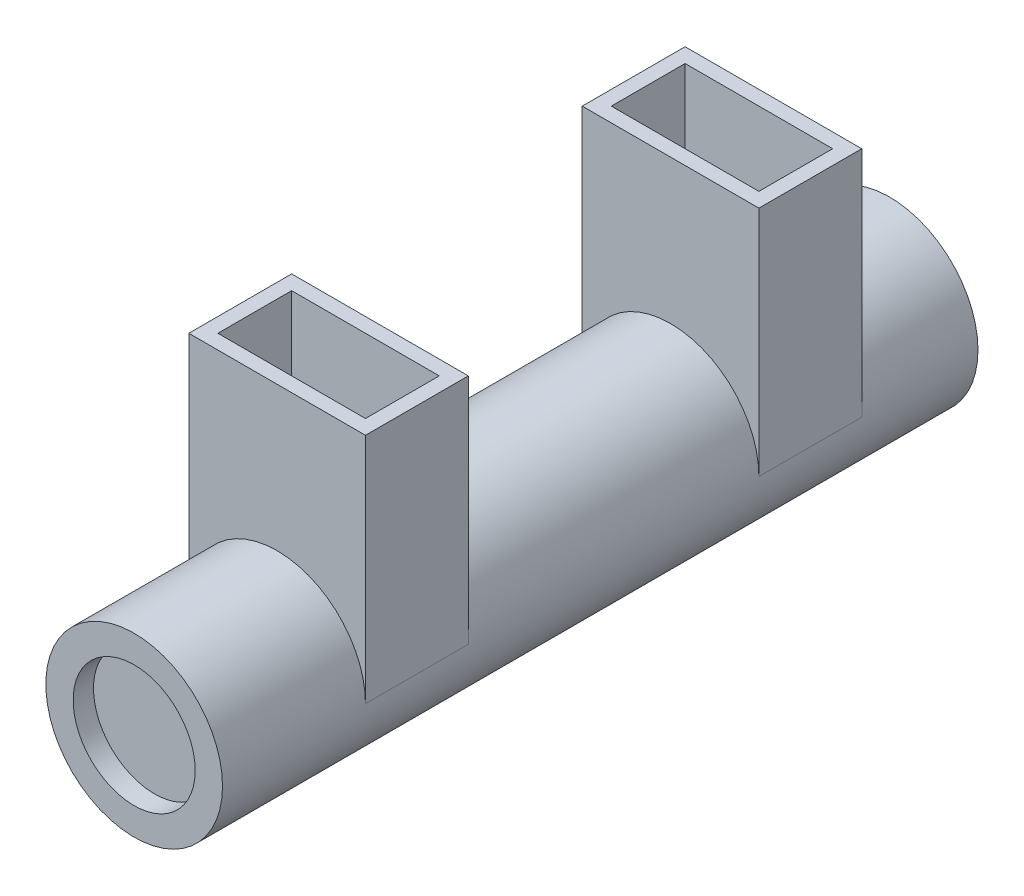
ISO-10303-21;
HEADER;
FILE_DESCRIPTION(('STEP AP214'),'2;1');
FILE_NAME('part.step','',(''),(''),'','','');
FILE_SCHEMA(('AUTOMOTIVE_DESIGN { 1 0 10303 214 1 1 1 1 }'));
ENDSEC;
DATA;
#1=APPLICATION_CONTEXT('core data for automotive mechanical design processes');
#2=APPLICATION_PROTOCOL_DEFINITION('international standard','automotive_design',2000,#1);
#3=PRODUCT_CONTEXT('',#1,'mechanical');
#4=PRODUCT('Part','Part','',(#3));
#5=PRODUCT_RELATED_PRODUCT_CATEGORY('part','',(#4));
#6=PRODUCT_DEFINITION_FORMATION('','',#4);
#7=PRODUCT_DEFINITION_CONTEXT('part definition',#1,'design');
#8=PRODUCT_DEFINITION('design','',#6,#7);
#9=PRODUCT_DEFINITION_SHAPE('','',#8);
#10=(LENGTH_UNIT() NAMED_UNIT(*) SI_UNIT(.MILLI.,.METRE.));
#11=(NAMED_UNIT(*) PLANE_ANGLE_UNIT() SI_UNIT($,.RADIAN.));
#12=(NAMED_UNIT(*) SI_UNIT($,.STERADIAN.) SOLID_ANGLE_UNIT());
#13=UNCERTAINTY_MEASURE_WITH_UNIT(LENGTH_MEASURE(1.E-05),#10,'distance_accuracy_value','');
#14=(GEOMETRIC_REPRESENTATION_CONTEXT(3) GLOBAL_UNCERTAINTY_ASSIGNED_CONTEXT((#13)) GLOBAL_UNIT_ASSIGNED_CONTEXT((#10,
#11,#12)) REPRESENTATION_CONTEXT('',''));
#15=CARTESIAN_POINT('',(0.,0.,0.));
#16=DIRECTION('',(0.,0.,1.));
#17=DIRECTION('',(1.,0.,0.));
#18=AXIS2_PLACEMENT_3D('',#15,#16,#17);
#19=CARTESIAN_POINT('',(0.,80.,250.8));
#20=DIRECTION('',(0.,1.,0.));
#21=DIRECTION('',(0.,0.,-1.));
#22=AXIS2_PLACEMENT_3D('',#19,#20,#21);
#23=PLANE('',#22);
#24=DIRECTION('',(0.,0.,-1.));
#25=VECTOR('',#24,1.);
#26=CARTESIAN_POINT('',(-30.4,80.,210.8));
#27=LINE('',#26,#25);
#28=CARTESIAN_POINT('',(-30.4,80.,210.8));
#29=VERTEX_POINT('',#28);
#30=CARTESIAN_POINT('',(-30.4,80.,175.4));
#31=VERTEX_POINT('',#30);
#32=EDGE_CURVE('E271',#29,#31,#27,.T.);
#33=ORIENTED_EDGE('',*,*,#32,.F.);
#34=DIRECTION('',(-1.,0.,0.));
#35=VECTOR('',#34,1.);
#36=CARTESIAN_POINT('',(-30.4,80.,210.8));
#37=LINE('',#36,#35);
#38=CARTESIAN_POINT('',(30.4,80.,210.8));
#39=VERTEX_POINT('',#38);
#40=EDGE_CURVE('E275',#39,#29,#37,.T.);
#41=ORIENTED_EDGE('',*,*,#40,.F.);
#42=DIRECTION('',(0.,0.,1.));
#43=VECTOR('',#42,1.);
#44=CARTESIAN_POINT('',(30.4,80.,210.8));
#45=LINE('',#44,#43);
#46=CARTESIAN_POINT('',(30.4,80.,175.4));
#47=VERTEX_POINT('',#46);
#48=EDGE_CURVE('E280',#47,#39,#45,.T.);
#49=ORIENTED_EDGE('',*,*,#48,.F.);
#50=DIRECTION('',(1.,0.,0.));
#51=VECTOR('',#50,1.);
#52=CARTESIAN_POINT('',(-30.4,80.,175.4));
#53=LINE('',#52,#51);
#54=EDGE_CURVE('E284',#31,#47,#53,.T.);
#55=ORIENTED_EDGE('',*,*,#54,.F.);
#56=EDGE_LOOP('',(#33,#41,#49,#55));
#57=FACE_BOUND('',#56,.T.);
#58=DIRECTION('',(1.,0.,0.));
#59=VECTOR('',#58,1.);
#60=CARTESIAN_POINT('',(-25.4,80.,180.4));
#61=LINE('',#60,#59);
#62=CARTESIAN_POINT('',(-25.4,80.,180.4));
#63=VERTEX_POINT('',#62);
#64=CARTESIAN_POINT('',(25.4,80.,180.4));
#65=VERTEX_POINT('',#64);
#66=EDGE_CURVE('E248',#63,#65,#61,.T.);
#67=ORIENTED_EDGE('',*,*,#66,.T.);
#68=DIRECTION('',(0.,0.,1.));
#69=VECTOR('',#68,1.);
#70=CARTESIAN_POINT('',(25.4,80.,180.4));
#71=LINE('',#70,#69);
#72=CARTESIAN_POINT('',(25.4,80.,205.8));
#73=VERTEX_POINT('',#72);
#74=EDGE_CURVE('E68',#65,#73,#71,.T.);
#75=ORIENTED_EDGE('',*,*,#74,.T.);
#76=DIRECTION('',(-1.,0.,0.));
#77=VECTOR('',#76,1.);
#78=CARTESIAN_POINT('',(-25.4,80.,205.8));
#79=LINE('',#78,#77);
#80=CARTESIAN_POINT('',(-25.4,80.,205.8));
#81=VERTEX_POINT('',#80);
#82=EDGE_CURVE('E236',#73,#81,#79,.T.);
#83=ORIENTED_EDGE('',*,*,#82,.T.);
#84=DIRECTION('',(0.,0.,-1.));
#85=VECTOR('',#84,1.);
#86=CARTESIAN_POINT('',(-25.4,80.,180.4));
#87=LINE('',#86,#85);
#88=EDGE_CURVE('E252',#81,#63,#87,.T.);
#89=ORIENTED_EDGE('',*,*,#88,.T.);
#90=EDGE_LOOP('',(#67,#75,#83,#89));
#91=FACE_BOUND('',#90,.T.);
#92=ADVANCED_FACE('F44',(#57,#91),#23,.T.);
#93=CARTESIAN_POINT('',(0.,0.,260.));
#94=DIRECTION('',(0.,0.,-1.));
#95=DIRECTION('',(-1.,0.,0.));
#96=AXIS2_PLACEMENT_3D('',#93,#94,#95);
#97=CYLINDRICAL_SURFACE('',#96,30.4);
#98=DIRECTION('',(0.,0.,1.));
#99=VECTOR('',#98,1.);
#100=CARTESIAN_POINT('',(30.4,0.,210.8));
#101=LINE('',#100,#99);
#102=CARTESIAN_POINT('',(30.4,0.,175.4));
#103=VERTEX_POINT('',#102);
#104=CARTESIAN_POINT('',(30.4,0.,210.8));
#105=VERTEX_POINT('',#104);
#106=EDGE_CURVE('E276',#103,#105,#101,.T.);
#107=ORIENTED_EDGE('',*,*,#106,.T.);
#108=CARTESIAN_POINT('',(0.,0.,210.8));
#109=DIRECTION('',(0.,0.,1.));
#110=DIRECTION('',(1.,0.,0.));
#111=AXIS2_PLACEMENT_3D('',#108,#109,#110);
#112=CIRCLE('',#111,30.4);
#113=CARTESIAN_POINT('',(-30.4,0.,210.8));
#114=VERTEX_POINT('',#113);
#115=EDGE_CURVE('E11',#105,#114,#112,.T.);
#116=ORIENTED_EDGE('',*,*,#115,.T.);
#117=DIRECTION('',(0.,0.,-1.));
#118=VECTOR('',#117,1.);
#119=CARTESIAN_POINT('',(-30.4,0.,210.8));
#120=LINE('',#119,#118);
#121=CARTESIAN_POINT('',(-30.4,0.,175.4));
#122=VERTEX_POINT('',#121);
#123=EDGE_CURVE('E262',#114,#122,#120,.T.);
#124=ORIENTED_EDGE('',*,*,#123,.T.);
#125=CARTESIAN_POINT('',(0.,0.,175.4));
#126=DIRECTION('',(0.,0.,-1.));
#127=DIRECTION('',(-1.,0.,0.));
#128=AXIS2_PLACEMENT_3D('',#125,#126,#127);
#129=CIRCLE('',#128,30.4);
#130=EDGE_CURVE('E53',#122,#103,#129,.T.);
#131=ORIENTED_EDGE('',*,*,#130,.T.);
#132=EDGE_LOOP('',(#107,#116,#124,#131));
#133=FACE_BOUND('',#132,.T.);
#134=CARTESIAN_POINT('',(0.,0.,0.));
#135=DIRECTION('',(0.,0.,1.));
#136=DIRECTION('',(1.,0.,0.));
#137=AXIS2_PLACEMENT_3D('',#134,#135,#136);
#138=CIRCLE('',#137,30.4);
#139=CARTESIAN_POINT('',(30.4,0.,0.));
#140=VERTEX_POINT('',#139);
#141=EDGE_CURVE('E389',#140,#140,#138,.T.);
#142=ORIENTED_EDGE('',*,*,#141,.T.);
#143=EDGE_LOOP('',(#142));
#144=FACE_BOUND('',#143,.T.);
#145=CARTESIAN_POINT('',(0.,0.,260.));
#146=DIRECTION('',(0.,0.,1.));
#147=DIRECTION('',(1.,0.,0.));
#148=AXIS2_PLACEMENT_3D('',#145,#146,#147);
#149=CIRCLE('',#148,30.4);
#150=CARTESIAN_POINT('',(30.4,0.,260.));
#151=VERTEX_POINT('',#150);
#152=EDGE_CURVE('E390',#151,#151,#149,.T.);
#153=ORIENTED_EDGE('',*,*,#152,.F.);
#154=EDGE_LOOP('',(#153));
#155=FACE_BOUND('',#154,.T.);
#156=CARTESIAN_POINT('',(0.,0.,75.4));
#157=DIRECTION('',(0.,0.,-1.));
#158=DIRECTION('',(-1.,0.,0.));
#159=AXIS2_PLACEMENT_3D('',#156,#157,#158);
#160=CIRCLE('',#159,30.4);
#161=CARTESIAN_POINT('',(-30.4,0.,75.4));
#162=VERTEX_POINT('',#161);
#163=CARTESIAN_POINT('',(30.4,0.,75.4));
#164=VERTEX_POINT('',#163);
#165=EDGE_CURVE('E401',#162,#164,#160,.T.);
#166=ORIENTED_EDGE('',*,*,#165,.F.);
#167=DIRECTION('',(0.,0.,1.));
#168=VECTOR('',#167,1.);
#169=CARTESIAN_POINT('',(-30.4,0.,40.));
#170=LINE('',#169,#168);
#171=CARTESIAN_POINT('',(-30.4,0.,40.));
#172=VERTEX_POINT('',#171);
#173=EDGE_CURVE('E343',#172,#162,#170,.T.);
#174=ORIENTED_EDGE('',*,*,#173,.F.);
#175=CARTESIAN_POINT('',(0.,0.,40.));
#176=DIRECTION('',(0.,0.,1.));
#177=DIRECTION('',(1.,0.,0.));
#178=AXIS2_PLACEMENT_3D('',#175,#176,#177);
#179=CIRCLE('',#178,30.4);
#180=CARTESIAN_POINT('',(30.4,0.,40.));
#181=VERTEX_POINT('',#180);
#182=EDGE_CURVE('E394',#181,#172,#179,.T.);
#183=ORIENTED_EDGE('',*,*,#182,.F.);
#184=DIRECTION('',(0.,0.,-1.));
#185=VECTOR('',#184,1.);
#186=CARTESIAN_POINT('',(30.4,0.,40.));
#187=LINE('',#186,#185);
#188=EDGE_CURVE('E358',#164,#181,#187,.T.);
#189=ORIENTED_EDGE('',*,*,#188,.F.);
#190=EDGE_LOOP('',(#166,#174,#183,#189));
#191=FACE_BOUND('',#190,.T.);
#192=ADVANCED_FACE('F46',(#133,#144,#155,#191),#97,.T.);
#193=CARTESIAN_POINT('',(0.,0.,260.));
#194=DIRECTION('',(0.,0.,1.));
#195=DIRECTION('',(1.,0.,0.));
#196=AXIS2_PLACEMENT_3D('',#193,#194,#195);
#197=PLANE('',#196);
#198=CARTESIAN_POINT('',(0.,0.,260.));
#199=DIRECTION('',(0.,0.,1.));
#200=DIRECTION('',(1.,0.,0.));
#201=AXIS2_PLACEMENT_3D('',#198,#199,#200);
#202=CIRCLE('',#201,21.);
#203=CARTESIAN_POINT('',(21.,0.,260.));
#204=VERTEX_POINT('',#203);
#205=EDGE_CURVE('E723',#204,#204,#202,.T.);
#206=ORIENTED_EDGE('',*,*,#205,.F.);
#207=EDGE_LOOP('',(#206));
#208=FACE_BOUND('',#207,.T.);
#209=ORIENTED_EDGE('',*,*,#152,.T.);
#210=EDGE_LOOP('',(#209));
#211=FACE_BOUND('',#210,.T.);
#212=ADVANCED_FACE('F441',(#208,#211),#197,.T.);
#213=CARTESIAN_POINT('',(0.,0.,0.));
#214=DIRECTION('',(0.,0.,1.));
#215=DIRECTION('',(1.,0.,0.));
#216=AXIS2_PLACEMENT_3D('',#213,#214,#215);
#217=PLANE('',#216);
#218=DIRECTION('',(0.,1.,0.));
#219=VECTOR('',#218,1.);
#220=CARTESIAN_POINT('',(-3.,9.53939201416945,0.));
#221=LINE('',#220,#219);
#222=CARTESIAN_POINT('',(-3.,9.53939201416945,0.));
#223=VERTEX_POINT('',#222);
#224=CARTESIAN_POINT('',(-3.,13.,0.));
#225=VERTEX_POINT('',#224);
#226=EDGE_CURVE('E209',#223,#225,#221,.T.);
#227=ORIENTED_EDGE('',*,*,#226,.F.);
#228=CARTESIAN_POINT('',(0.,0.,0.));
#229=DIRECTION('',(0.,0.,-1.));
#230=DIRECTION('',(-1.,0.,0.));
#231=AXIS2_PLACEMENT_3D('',#228,#229,#230);
#232=CIRCLE('',#231,10.);
#233=CARTESIAN_POINT('',(3.,9.53939201416945,0.));
#234=VERTEX_POINT('',#233);
#235=EDGE_CURVE('E201',#234,#223,#232,.T.);
#236=ORIENTED_EDGE('',*,*,#235,.F.);
#237=DIRECTION('',(0.,1.,0.));
#238=VECTOR('',#237,1.);
#239=CARTESIAN_POINT('',(3.,9.53939201416945,0.));
#240=LINE('',#239,#238);
#241=CARTESIAN_POINT('',(3.,13.,0.));
#242=VERTEX_POINT('',#241);
#243=EDGE_CURVE('E215',#234,#242,#240,.T.);
#244=ORIENTED_EDGE('',*,*,#243,.T.);
#245=DIRECTION('',(-1.,0.,0.));
#246=VECTOR('',#245,1.);
#247=CARTESIAN_POINT('',(3.,13.,0.));
#248=LINE('',#247,#246);
#249=EDGE_CURVE('E60',#242,#225,#248,.T.);
#250=ORIENTED_EDGE('',*,*,#249,.T.);
#251=EDGE_LOOP('',(#227,#236,#244,#250));
#252=FACE_BOUND('',#251,.T.);
#253=ORIENTED_EDGE('',*,*,#141,.F.);
#254=EDGE_LOOP('',(#253));
#255=FACE_BOUND('',#254,.T.);
#256=ADVANCED_FACE('F505',(#252,#255),#217,.F.);
#257=CARTESIAN_POINT('',(-30.4,80.,40.));
#258=DIRECTION('',(1.,0.,0.));
#259=DIRECTION('',(0.,0.,-1.));
#260=AXIS2_PLACEMENT_3D('',#257,#258,#259);
#261=PLANE('',#260);
#262=ORIENTED_EDGE('',*,*,#173,.T.);
#263=DIRECTION('',(0.,-1.,0.));
#264=VECTOR('',#263,1.);
#265=CARTESIAN_POINT('',(-30.4,80.,75.4));
#266=LINE('',#265,#264);
#267=CARTESIAN_POINT('',(-30.4,80.,75.4));
#268=VERTEX_POINT('',#267);
#269=EDGE_CURVE('E385',#268,#162,#266,.T.);
#270=ORIENTED_EDGE('',*,*,#269,.F.);
#271=DIRECTION('',(0.,0.,1.));
#272=VECTOR('',#271,1.);
#273=CARTESIAN_POINT('',(-30.4,80.,40.));
#274=LINE('',#273,#272);
#275=CARTESIAN_POINT('',(-30.4,80.,40.));
#276=VERTEX_POINT('',#275);
#277=EDGE_CURVE('E353',#276,#268,#274,.T.);
#278=ORIENTED_EDGE('',*,*,#277,.F.);
#279=DIRECTION('',(0.,-1.,0.));
#280=VECTOR('',#279,1.);
#281=CARTESIAN_POINT('',(-30.4,80.,40.));
#282=LINE('',#281,#280);
#283=EDGE_CURVE('E367',#276,#172,#282,.T.);
#284=ORIENTED_EDGE('',*,*,#283,.T.);
#285=EDGE_LOOP('',(#262,#270,#278,#284));
#286=FACE_BOUND('',#285,.T.);
#287=ADVANCED_FACE('F509',(#286),#261,.F.);
#288=CARTESIAN_POINT('',(-30.4,80.,75.4));
#289=DIRECTION('',(0.,0.,-1.));
#290=DIRECTION('',(-1.,0.,0.));
#291=AXIS2_PLACEMENT_3D('',#288,#289,#290);
#292=PLANE('',#291);
#293=ORIENTED_EDGE('',*,*,#269,.T.);
#294=ORIENTED_EDGE('',*,*,#165,.T.);
#295=DIRECTION('',(0.,-1.,0.));
#296=VECTOR('',#295,1.);
#297=CARTESIAN_POINT('',(30.4,80.,75.4));
#298=LINE('',#297,#296);
#299=CARTESIAN_POINT('',(30.4,80.,75.4));
#300=VERTEX_POINT('',#299);
#301=EDGE_CURVE('E381',#300,#164,#298,.T.);
#302=ORIENTED_EDGE('',*,*,#301,.F.);
#303=DIRECTION('',(1.,0.,0.));
#304=VECTOR('',#303,1.);
#305=CARTESIAN_POINT('',(-30.4,80.,75.4));
#306=LINE('',#305,#304);
#307=EDGE_CURVE('E357',#268,#300,#306,.T.);
#308=ORIENTED_EDGE('',*,*,#307,.F.);
#309=EDGE_LOOP('',(#293,#294,#302,#308));
#310=FACE_BOUND('',#309,.T.);
#311=ADVANCED_FACE('F666',(#310),#292,.F.);
#312=CARTESIAN_POINT('',(30.4,80.,40.));
#313=DIRECTION('',(-1.,0.,0.));
#314=DIRECTION('',(0.,0.,1.));
#315=AXIS2_PLACEMENT_3D('',#312,#313,#314);
#316=PLANE('',#315);
#317=ORIENTED_EDGE('',*,*,#188,.T.);
#318=DIRECTION('',(0.,-1.,0.));
#319=VECTOR('',#318,1.);
#320=CARTESIAN_POINT('',(30.4,80.,40.));
#321=LINE('',#320,#319);
#322=CARTESIAN_POINT('',(30.4,80.,40.));
#323=VERTEX_POINT('',#322);
#324=EDGE_CURVE('E377',#323,#181,#321,.T.);
#325=ORIENTED_EDGE('',*,*,#324,.F.);
#326=DIRECTION('',(0.,0.,-1.));
#327=VECTOR('',#326,1.);
#328=CARTESIAN_POINT('',(30.4,80.,40.));
#329=LINE('',#328,#327);
#330=EDGE_CURVE('E361',#300,#323,#329,.T.);
#331=ORIENTED_EDGE('',*,*,#330,.F.);
#332=ORIENTED_EDGE('',*,*,#301,.T.);
#333=EDGE_LOOP('',(#317,#325,#331,#332));
#334=FACE_BOUND('',#333,.T.);
#335=ADVANCED_FACE('F657',(#334),#316,.F.);
#336=CARTESIAN_POINT('',(-30.4,80.,40.));
#337=DIRECTION('',(0.,0.,1.));
#338=DIRECTION('',(1.,0.,0.));
#339=AXIS2_PLACEMENT_3D('',#336,#337,#338);
#340=PLANE('',#339);
#341=ORIENTED_EDGE('',*,*,#324,.T.);
#342=ORIENTED_EDGE('',*,*,#182,.T.);
#343=ORIENTED_EDGE('',*,*,#283,.F.);
#344=DIRECTION('',(-1.,0.,0.));
#345=VECTOR('',#344,1.);
#346=CARTESIAN_POINT('',(-30.4,80.,40.));
#347=LINE('',#346,#345);
#348=EDGE_CURVE('E364',#323,#276,#347,.T.);
#349=ORIENTED_EDGE('',*,*,#348,.F.);
#350=EDGE_LOOP('',(#341,#342,#343,#349));
#351=FACE_BOUND('',#350,.T.);
#352=ADVANCED_FACE('F648',(#351),#340,.F.);
#353=CARTESIAN_POINT('',(0.,80.,0.));
#354=DIRECTION('',(0.,1.,0.));
#355=DIRECTION('',(0.,0.,1.));
#356=AXIS2_PLACEMENT_3D('',#353,#354,#355);
#357=PLANE('',#356);
#358=DIRECTION('',(0.,0.,-1.));
#359=VECTOR('',#358,1.);
#360=CARTESIAN_POINT('',(25.4,80.,70.4));
#361=LINE('',#360,#359);
#362=CARTESIAN_POINT('',(25.4,80.,70.4));
#363=VERTEX_POINT('',#362);
#364=CARTESIAN_POINT('',(25.4,80.,45.));
#365=VERTEX_POINT('',#364);
#366=EDGE_CURVE('E308',#363,#365,#361,.T.);
#367=ORIENTED_EDGE('',*,*,#366,.F.);
#368=DIRECTION('',(1.,0.,0.));
#369=VECTOR('',#368,1.);
#370=CARTESIAN_POINT('',(-25.4,80.,70.4));
#371=LINE('',#370,#369);
#372=CARTESIAN_POINT('',(-25.4,80.,70.4));
#373=VERTEX_POINT('',#372);
#374=EDGE_CURVE('E314',#373,#363,#371,.T.);
#375=ORIENTED_EDGE('',*,*,#374,.F.);
#376=DIRECTION('',(0.,0.,1.));
#377=VECTOR('',#376,1.);
#378=CARTESIAN_POINT('',(-25.4,80.,70.4));
#379=LINE('',#378,#377);
#380=CARTESIAN_POINT('',(-25.4,80.,45.));
#381=VERTEX_POINT('',#380);
#382=EDGE_CURVE('E333',#381,#373,#379,.T.);
#383=ORIENTED_EDGE('',*,*,#382,.F.);
#384=DIRECTION('',(-1.,0.,0.));
#385=VECTOR('',#384,1.);
#386=CARTESIAN_POINT('',(-25.4,80.,45.));
#387=LINE('',#386,#385);
#388=EDGE_CURVE('E329',#365,#381,#387,.T.);
#389=ORIENTED_EDGE('',*,*,#388,.F.);
#390=EDGE_LOOP('',(#367,#375,#383,#389));
#391=FACE_BOUND('',#390,.T.);
#392=ORIENTED_EDGE('',*,*,#277,.T.);
#393=ORIENTED_EDGE('',*,*,#307,.T.);
#394=ORIENTED_EDGE('',*,*,#330,.T.);
#395=ORIENTED_EDGE('',*,*,#348,.T.);
#396=EDGE_LOOP('',(#392,#393,#394,#395));
#397=FACE_BOUND('',#396,.T.);
#398=ADVANCED_FACE('F639',(#391,#397),#357,.T.);
#399=CARTESIAN_POINT('',(25.4,0.,70.4));
#400=DIRECTION('',(1.,0.,0.));
#401=DIRECTION('',(0.,0.,-1.));
#402=AXIS2_PLACEMENT_3D('',#399,#400,#401);
#403=PLANE('',#402);
#404=ORIENTED_EDGE('',*,*,#366,.T.);
#405=DIRECTION('',(0.,1.,0.));
#406=VECTOR('',#405,1.);
#407=CARTESIAN_POINT('',(25.4,0.,45.));
#408=LINE('',#407,#406);
#409=CARTESIAN_POINT('',(25.4,0.,45.));
#410=VERTEX_POINT('',#409);
#411=EDGE_CURVE('E326',#410,#365,#408,.T.);
#412=ORIENTED_EDGE('',*,*,#411,.F.);
#413=DIRECTION('',(0.,0.,-1.));
#414=VECTOR('',#413,1.);
#415=CARTESIAN_POINT('',(25.4,0.,70.4));
#416=LINE('',#415,#414);
#417=CARTESIAN_POINT('',(25.4,0.,70.4));
#418=VERTEX_POINT('',#417);
#419=EDGE_CURVE('E309',#418,#410,#416,.T.);
#420=ORIENTED_EDGE('',*,*,#419,.F.);
#421=DIRECTION('',(0.,1.,0.));
#422=VECTOR('',#421,1.);
#423=CARTESIAN_POINT('',(25.4,0.,70.4));
#424=LINE('',#423,#422);
#425=EDGE_CURVE('E340',#418,#363,#424,.T.);
#426=ORIENTED_EDGE('',*,*,#425,.T.);
#427=EDGE_LOOP('',(#404,#412,#420,#426));
#428=FACE_BOUND('',#427,.T.);
#429=ADVANCED_FACE('F630',(#428),#403,.F.);
#430=CARTESIAN_POINT('',(-25.4,0.,70.4));
#431=DIRECTION('',(0.,0.,1.));
#432=DIRECTION('',(1.,0.,0.));
#433=AXIS2_PLACEMENT_3D('',#430,#431,#432);
#434=PLANE('',#433);
#435=ORIENTED_EDGE('',*,*,#374,.T.);
#436=ORIENTED_EDGE('',*,*,#425,.F.);
#437=DIRECTION('',(1.,0.,0.));
#438=VECTOR('',#437,1.);
#439=CARTESIAN_POINT('',(-25.4,0.,70.4));
#440=LINE('',#439,#438);
#441=CARTESIAN_POINT('',(-25.4,0.,70.4));
#442=VERTEX_POINT('',#441);
#443=EDGE_CURVE('E322',#442,#418,#440,.T.);
#444=ORIENTED_EDGE('',*,*,#443,.F.);
#445=DIRECTION('',(0.,1.,0.));
#446=VECTOR('',#445,1.);
#447=CARTESIAN_POINT('',(-25.4,0.,70.4));
#448=LINE('',#447,#446);
#449=EDGE_CURVE('E344',#442,#373,#448,.T.);
#450=ORIENTED_EDGE('',*,*,#449,.T.);
#451=EDGE_LOOP('',(#435,#436,#444,#450));
#452=FACE_BOUND('',#451,.T.);
#453=ADVANCED_FACE('F621',(#452),#434,.F.);
#454=CARTESIAN_POINT('',(-25.4,0.,70.4));
#455=DIRECTION('',(-1.,0.,0.));
#456=DIRECTION('',(0.,0.,1.));
#457=AXIS2_PLACEMENT_3D('',#454,#455,#456);
#458=PLANE('',#457);
#459=ORIENTED_EDGE('',*,*,#382,.T.);
#460=ORIENTED_EDGE('',*,*,#449,.F.);
#461=DIRECTION('',(0.,0.,1.));
#462=VECTOR('',#461,1.);
#463=CARTESIAN_POINT('',(-25.4,0.,70.4));
#464=LINE('',#463,#462);
#465=CARTESIAN_POINT('',(-25.4,0.,45.));
#466=VERTEX_POINT('',#465);
#467=EDGE_CURVE('E318',#466,#442,#464,.T.);
#468=ORIENTED_EDGE('',*,*,#467,.F.);
#469=DIRECTION('',(0.,1.,0.));
#470=VECTOR('',#469,1.);
#471=CARTESIAN_POINT('',(-25.4,0.,45.));
#472=LINE('',#471,#470);
#473=EDGE_CURVE('E347',#466,#381,#472,.T.);
#474=ORIENTED_EDGE('',*,*,#473,.T.);
#475=EDGE_LOOP('',(#459,#460,#468,#474));
#476=FACE_BOUND('',#475,.T.);
#477=ADVANCED_FACE('F612',(#476),#458,.F.);
#478=CARTESIAN_POINT('',(-25.4,0.,45.));
#479=DIRECTION('',(0.,0.,-1.));
#480=DIRECTION('',(-1.,0.,0.));
#481=AXIS2_PLACEMENT_3D('',#478,#479,#480);
#482=PLANE('',#481);
#483=ORIENTED_EDGE('',*,*,#388,.T.);
#484=ORIENTED_EDGE('',*,*,#473,.F.);
#485=DIRECTION('',(-1.,0.,0.));
#486=VECTOR('',#485,1.);
#487=CARTESIAN_POINT('',(-25.4,0.,45.));
#488=LINE('',#487,#486);
#489=EDGE_CURVE('E313',#410,#466,#488,.T.);
#490=ORIENTED_EDGE('',*,*,#489,.F.);
#491=ORIENTED_EDGE('',*,*,#411,.T.);
#492=EDGE_LOOP('',(#483,#484,#490,#491));
#493=FACE_BOUND('',#492,.T.);
#494=ADVANCED_FACE('F434',(#493),#482,.F.);
#495=CARTESIAN_POINT('',(0.,0.,0.));
#496=DIRECTION('',(0.,-1.,0.));
#497=DIRECTION('',(0.,0.,-1.));
#498=AXIS2_PLACEMENT_3D('',#495,#496,#497);
#499=PLANE('',#498);
#500=ORIENTED_EDGE('',*,*,#419,.T.);
#501=ORIENTED_EDGE('',*,*,#489,.T.);
#502=ORIENTED_EDGE('',*,*,#467,.T.);
#503=ORIENTED_EDGE('',*,*,#443,.T.);
#504=EDGE_LOOP('',(#500,#501,#502,#503));
#505=FACE_BOUND('',#504,.T.);
#506=ADVANCED_FACE('F426',(#505),#499,.F.);
#507=CARTESIAN_POINT('',(-30.4,80.,210.8));
#508=DIRECTION('',(-1.,0.,0.));
#509=DIRECTION('',(0.,0.,1.));
#510=AXIS2_PLACEMENT_3D('',#507,#508,#509);
#511=PLANE('',#510);
#512=ORIENTED_EDGE('',*,*,#123,.F.);
#513=DIRECTION('',(0.,-1.,0.));
#514=VECTOR('',#513,1.);
#515=CARTESIAN_POINT('',(-30.4,80.,210.8));
#516=LINE('',#515,#514);
#517=EDGE_CURVE('E304',#29,#114,#516,.T.);
#518=ORIENTED_EDGE('',*,*,#517,.F.);
#519=ORIENTED_EDGE('',*,*,#32,.T.);
#520=DIRECTION('',(0.,-1.,0.));
#521=VECTOR('',#520,1.);
#522=CARTESIAN_POINT('',(-30.4,80.,175.4));
#523=LINE('',#522,#521);
#524=EDGE_CURVE('E288',#31,#122,#523,.T.);
#525=ORIENTED_EDGE('',*,*,#524,.T.);
#526=EDGE_LOOP('',(#512,#518,#519,#525));
#527=FACE_BOUND('',#526,.T.);
#528=ADVANCED_FACE('F424',(#527),#511,.T.);
#529=CARTESIAN_POINT('',(-30.4,80.,210.8));
#530=DIRECTION('',(0.,0.,1.));
#531=DIRECTION('',(1.,0.,0.));
#532=AXIS2_PLACEMENT_3D('',#529,#530,#531);
#533=PLANE('',#532);
#534=ORIENTED_EDGE('',*,*,#115,.F.);
#535=DIRECTION('',(0.,-1.,0.));
#536=VECTOR('',#535,1.);
#537=CARTESIAN_POINT('',(30.4,80.,210.8));
#538=LINE('',#537,#536);
#539=EDGE_CURVE('E300',#39,#105,#538,.T.);
#540=ORIENTED_EDGE('',*,*,#539,.F.);
#541=ORIENTED_EDGE('',*,*,#40,.T.);
#542=ORIENTED_EDGE('',*,*,#517,.T.);
#543=EDGE_LOOP('',(#534,#540,#541,#542));
#544=FACE_BOUND('',#543,.T.);
#545=ADVANCED_FACE('F419',(#544),#533,.T.);
#546=CARTESIAN_POINT('',(30.4,80.,210.8));
#547=DIRECTION('',(1.,0.,0.));
#548=DIRECTION('',(0.,0.,-1.));
#549=AXIS2_PLACEMENT_3D('',#546,#547,#548);
#550=PLANE('',#549);
#551=ORIENTED_EDGE('',*,*,#106,.F.);
#552=DIRECTION('',(0.,-1.,0.));
#553=VECTOR('',#552,1.);
#554=CARTESIAN_POINT('',(30.4,80.,175.4));
#555=LINE('',#554,#553);
#556=EDGE_CURVE('E296',#47,#103,#555,.T.);
#557=ORIENTED_EDGE('',*,*,#556,.F.);
#558=ORIENTED_EDGE('',*,*,#48,.T.);
#559=ORIENTED_EDGE('',*,*,#539,.T.);
#560=EDGE_LOOP('',(#551,#557,#558,#559));
#561=FACE_BOUND('',#560,.T.);
#562=ADVANCED_FACE('F416',(#561),#550,.T.);
#563=CARTESIAN_POINT('',(-30.4,80.,175.4));
#564=DIRECTION('',(0.,0.,-1.));
#565=DIRECTION('',(-1.,0.,0.));
#566=AXIS2_PLACEMENT_3D('',#563,#564,#565);
#567=PLANE('',#566);
#568=ORIENTED_EDGE('',*,*,#130,.F.);
#569=ORIENTED_EDGE('',*,*,#524,.F.);
#570=ORIENTED_EDGE('',*,*,#54,.T.);
#571=ORIENTED_EDGE('',*,*,#556,.T.);
#572=EDGE_LOOP('',(#568,#569,#570,#571));
#573=FACE_BOUND('',#572,.T.);
#574=ADVANCED_FACE('F412',(#573),#567,.T.);
#575=CARTESIAN_POINT('',(25.4,0.,180.4));
#576=DIRECTION('',(-1.,0.,0.));
#577=DIRECTION('',(0.,0.,1.));
#578=AXIS2_PLACEMENT_3D('',#575,#576,#577);
#579=PLANE('',#578);
#580=ORIENTED_EDGE('',*,*,#74,.F.);
#581=DIRECTION('',(0.,1.,0.));
#582=VECTOR('',#581,1.);
#583=CARTESIAN_POINT('',(25.4,0.,180.4));
#584=LINE('',#583,#582);
#585=CARTESIAN_POINT('',(25.4,0.,180.4));
#586=VERTEX_POINT('',#585);
#587=EDGE_CURVE('E245',#586,#65,#584,.T.);
#588=ORIENTED_EDGE('',*,*,#587,.F.);
#589=DIRECTION('',(0.,0.,1.));
#590=VECTOR('',#589,1.);
#591=CARTESIAN_POINT('',(25.4,0.,180.4));
#592=LINE('',#591,#590);
#593=CARTESIAN_POINT('',(25.4,0.,205.8));
#594=VERTEX_POINT('',#593);
#595=EDGE_CURVE('E231',#586,#594,#592,.T.);
#596=ORIENTED_EDGE('',*,*,#595,.T.);
#597=DIRECTION('',(0.,1.,0.));
#598=VECTOR('',#597,1.);
#599=CARTESIAN_POINT('',(25.4,0.,205.8));
#600=LINE('',#599,#598);
#601=EDGE_CURVE('E259',#594,#73,#600,.T.);
#602=ORIENTED_EDGE('',*,*,#601,.T.);
#603=EDGE_LOOP('',(#580,#588,#596,#602));
#604=FACE_BOUND('',#603,.T.);
#605=ADVANCED_FACE('F444',(#604),#579,.T.);
#606=CARTESIAN_POINT('',(-25.4,0.,205.8));
#607=DIRECTION('',(0.,0.,-1.));
#608=DIRECTION('',(-1.,0.,0.));
#609=AXIS2_PLACEMENT_3D('',#606,#607,#608);
#610=PLANE('',#609);
#611=ORIENTED_EDGE('',*,*,#82,.F.);
#612=ORIENTED_EDGE('',*,*,#601,.F.);
#613=DIRECTION('',(-1.,0.,0.));
#614=VECTOR('',#613,1.);
#615=CARTESIAN_POINT('',(-25.4,0.,205.8));
#616=LINE('',#615,#614);
#617=CARTESIAN_POINT('',(-25.4,0.,205.8));
#618=VERTEX_POINT('',#617);
#619=EDGE_CURVE('E242',#594,#618,#616,.T.);
#620=ORIENTED_EDGE('',*,*,#619,.T.);
#621=DIRECTION('',(0.,1.,0.));
#622=VECTOR('',#621,1.);
#623=CARTESIAN_POINT('',(-25.4,0.,205.8));
#624=LINE('',#623,#622);
#625=EDGE_CURVE('E263',#618,#81,#624,.T.);
#626=ORIENTED_EDGE('',*,*,#625,.T.);
#627=EDGE_LOOP('',(#611,#612,#620,#626));
#628=FACE_BOUND('',#627,.T.);
#629=ADVANCED_FACE('F466',(#628),#610,.T.);
#630=CARTESIAN_POINT('',(-25.4,0.,180.4));
#631=DIRECTION('',(1.,0.,0.));
#632=DIRECTION('',(0.,0.,-1.));
#633=AXIS2_PLACEMENT_3D('',#630,#631,#632);
#634=PLANE('',#633);
#635=ORIENTED_EDGE('',*,*,#88,.F.);
#636=ORIENTED_EDGE('',*,*,#625,.F.);
#637=DIRECTION('',(0.,0.,-1.));
#638=VECTOR('',#637,1.);
#639=CARTESIAN_POINT('',(-25.4,0.,180.4));
#640=LINE('',#639,#638);
#641=CARTESIAN_POINT('',(-25.4,0.,180.4));
#642=VERTEX_POINT('',#641);
#643=EDGE_CURVE('E239',#618,#642,#640,.T.);
#644=ORIENTED_EDGE('',*,*,#643,.T.);
#645=DIRECTION('',(0.,1.,0.));
#646=VECTOR('',#645,1.);
#647=CARTESIAN_POINT('',(-25.4,0.,180.4));
#648=LINE('',#647,#646);
#649=EDGE_CURVE('E266',#642,#63,#648,.T.);
#650=ORIENTED_EDGE('',*,*,#649,.T.);
#651=EDGE_LOOP('',(#635,#636,#644,#650));
#652=FACE_BOUND('',#651,.T.);
#653=ADVANCED_FACE('F473',(#652),#634,.T.);
#654=CARTESIAN_POINT('',(-25.4,0.,180.4));
#655=DIRECTION('',(0.,0.,1.));
#656=DIRECTION('',(1.,0.,0.));
#657=AXIS2_PLACEMENT_3D('',#654,#655,#656);
#658=PLANE('',#657);
#659=ORIENTED_EDGE('',*,*,#66,.F.);
#660=ORIENTED_EDGE('',*,*,#649,.F.);
#661=DIRECTION('',(1.,0.,0.));
#662=VECTOR('',#661,1.);
#663=CARTESIAN_POINT('',(-25.4,0.,180.4));
#664=LINE('',#663,#662);
#665=EDGE_CURVE('E235',#642,#586,#664,.T.);
#666=ORIENTED_EDGE('',*,*,#665,.T.);
#667=ORIENTED_EDGE('',*,*,#587,.T.);
#668=EDGE_LOOP('',(#659,#660,#666,#667));
#669=FACE_BOUND('',#668,.T.);
#670=ADVANCED_FACE('F482',(#669),#658,.T.);
#671=CARTESIAN_POINT('',(0.,0.,250.8));
#672=DIRECTION('',(0.,-1.,0.));
#673=DIRECTION('',(0.,0.,1.));
#674=AXIS2_PLACEMENT_3D('',#671,#672,#673);
#675=PLANE('',#674);
#676=ORIENTED_EDGE('',*,*,#595,.F.);
#677=ORIENTED_EDGE('',*,*,#665,.F.);
#678=ORIENTED_EDGE('',*,*,#643,.F.);
#679=ORIENTED_EDGE('',*,*,#619,.F.);
#680=EDGE_LOOP('',(#676,#677,#678,#679));
#681=FACE_BOUND('',#680,.T.);
#682=ADVANCED_FACE('F491',(#681),#675,.F.);
#683=CARTESIAN_POINT('',(-30.4,80.,40.));
#684=DIRECTION('',(0.,0.,1.));
#685=DIRECTION('',(1.,0.,0.));
#686=AXIS2_PLACEMENT_3D('',#683,#684,#685);
#687=PLANE('',#686);
#688=CARTESIAN_POINT('',(0.,0.,40.));
#689=DIRECTION('',(0.,0.,1.));
#690=DIRECTION('',(1.,0.,0.));
#691=AXIS2_PLACEMENT_3D('',#688,#689,#690);
#692=CIRCLE('',#691,10.);
#693=CARTESIAN_POINT('',(3.,9.53939201416945,40.));
#694=VERTEX_POINT('',#693);
#695=CARTESIAN_POINT('',(-3.,9.53939201416945,40.));
#696=VERTEX_POINT('',#695);
#697=EDGE_CURVE('E198',#694,#696,#692,.F.);
#698=ORIENTED_EDGE('',*,*,#697,.T.);
#699=DIRECTION('',(0.,1.,0.));
#700=VECTOR('',#699,1.);
#701=CARTESIAN_POINT('',(-3.,9.53939201416945,40.));
#702=LINE('',#701,#700);
#703=CARTESIAN_POINT('',(-3.,13.,40.));
#704=VERTEX_POINT('',#703);
#705=EDGE_CURVE('E184',#696,#704,#702,.T.);
#706=ORIENTED_EDGE('',*,*,#705,.T.);
#707=DIRECTION('',(-1.,0.,0.));
#708=VECTOR('',#707,1.);
#709=CARTESIAN_POINT('',(3.,13.,40.));
#710=LINE('',#709,#708);
#711=CARTESIAN_POINT('',(3.,13.,40.));
#712=VERTEX_POINT('',#711);
#713=EDGE_CURVE('E219',#712,#704,#710,.T.);
#714=ORIENTED_EDGE('',*,*,#713,.F.);
#715=DIRECTION('',(0.,1.,0.));
#716=VECTOR('',#715,1.);
#717=CARTESIAN_POINT('',(3.,9.53939201416945,40.));
#718=LINE('',#717,#716);
#719=EDGE_CURVE('E206',#694,#712,#718,.T.);
#720=ORIENTED_EDGE('',*,*,#719,.F.);
#721=EDGE_LOOP('',(#698,#706,#714,#720));
#722=FACE_BOUND('',#721,.T.);
#723=ADVANCED_FACE('F205',(#722),#687,.F.);
#724=CARTESIAN_POINT('',(0.,0.,70.4795013082563));
#725=DIRECTION('',(0.,0.,-1.));
#726=DIRECTION('',(-1.,0.,0.));
#727=AXIS2_PLACEMENT_3D('',#724,#725,#726);
#728=CYLINDRICAL_SURFACE('',#727,10.);
#729=DIRECTION('',(0.,0.,-1.));
#730=VECTOR('',#729,1.);
#731=CARTESIAN_POINT('',(3.,9.53939201416945,70.4795013082563));
#732=LINE('',#731,#730);
#733=EDGE_CURVE('E228',#694,#234,#732,.T.);
#734=ORIENTED_EDGE('',*,*,#733,.T.);
#735=ORIENTED_EDGE('',*,*,#235,.T.);
#736=DIRECTION('',(0.,0.,-1.));
#737=VECTOR('',#736,1.);
#738=CARTESIAN_POINT('',(-3.,9.53939201416945,70.4795013082563));
#739=LINE('',#738,#737);
#740=EDGE_CURVE('E188',#696,#223,#739,.T.);
#741=ORIENTED_EDGE('',*,*,#740,.F.);
#742=ORIENTED_EDGE('',*,*,#697,.F.);
#743=EDGE_LOOP('',(#734,#735,#741,#742));
#744=FACE_BOUND('',#743,.T.);
#745=ADVANCED_FACE('F197',(#744),#728,.F.);
#746=CARTESIAN_POINT('',(-3.,9.53939201416945,70.4795013082563));
#747=DIRECTION('',(-1.,0.,0.));
#748=DIRECTION('',(0.,0.,1.));
#749=AXIS2_PLACEMENT_3D('',#746,#747,#748);
#750=PLANE('',#749);
#751=ORIENTED_EDGE('',*,*,#740,.T.);
#752=ORIENTED_EDGE('',*,*,#226,.T.);
#753=DIRECTION('',(0.,0.,-1.));
#754=VECTOR('',#753,1.);
#755=CARTESIAN_POINT('',(-3.,13.,70.4795013082563));
#756=LINE('',#755,#754);
#757=EDGE_CURVE('E190',#704,#225,#756,.T.);
#758=ORIENTED_EDGE('',*,*,#757,.F.);
#759=ORIENTED_EDGE('',*,*,#705,.F.);
#760=EDGE_LOOP('',(#751,#752,#758,#759));
#761=FACE_BOUND('',#760,.T.);
#762=ADVANCED_FACE('F186',(#761),#750,.F.);
#763=CARTESIAN_POINT('',(3.,13.,70.4795013082563));
#764=DIRECTION('',(0.,-1.,0.));
#765=DIRECTION('',(0.,0.,-1.));
#766=AXIS2_PLACEMENT_3D('',#763,#764,#765);
#767=PLANE('',#766);
#768=ORIENTED_EDGE('',*,*,#713,.T.);
#769=ORIENTED_EDGE('',*,*,#757,.T.);
#770=ORIENTED_EDGE('',*,*,#249,.F.);
#771=DIRECTION('',(0.,0.,-1.));
#772=VECTOR('',#771,1.);
#773=CARTESIAN_POINT('',(3.,13.,70.4795013082563));
#774=LINE('',#773,#772);
#775=EDGE_CURVE('E223',#712,#242,#774,.T.);
#776=ORIENTED_EDGE('',*,*,#775,.F.);
#777=EDGE_LOOP('',(#768,#769,#770,#776));
#778=FACE_BOUND('',#777,.T.);
#779=ADVANCED_FACE('F532',(#778),#767,.T.);
#780=CARTESIAN_POINT('',(3.,9.53939201416945,70.4795013082563));
#781=DIRECTION('',(-1.,0.,0.));
#782=DIRECTION('',(0.,0.,1.));
#783=AXIS2_PLACEMENT_3D('',#780,#781,#782);
#784=PLANE('',#783);
#785=ORIENTED_EDGE('',*,*,#719,.T.);
#786=ORIENTED_EDGE('',*,*,#775,.T.);
#787=ORIENTED_EDGE('',*,*,#243,.F.);
#788=ORIENTED_EDGE('',*,*,#733,.F.);
#789=EDGE_LOOP('',(#785,#786,#787,#788));
#790=FACE_BOUND('',#789,.T.);
#791=ADVANCED_FACE('F540',(#790),#784,.T.);
#792=CARTESIAN_POINT('',(0.,0.,253.));
#793=DIRECTION('',(0.,0.,1.));
#794=DIRECTION('',(1.,0.,0.));
#795=AXIS2_PLACEMENT_3D('',#792,#793,#794);
#796=CYLINDRICAL_SURFACE('',#795,21.);
#797=CARTESIAN_POINT('',(0.,0.,253.));
#798=DIRECTION('',(0.,0.,1.));
#799=DIRECTION('',(1.,0.,0.));
#800=AXIS2_PLACEMENT_3D('',#797,#798,#799);
#801=CIRCLE('',#800,21.);
#802=CARTESIAN_POINT('',(21.,0.,253.));
#803=VERTEX_POINT('',#802);
#804=EDGE_CURVE('E220',#803,#803,#801,.T.);
#805=ORIENTED_EDGE('',*,*,#804,.F.);
#806=EDGE_LOOP('',(#805));
#807=FACE_BOUND('',#806,.T.);
#808=ORIENTED_EDGE('',*,*,#205,.T.);
#809=EDGE_LOOP('',(#808));
#810=FACE_BOUND('',#809,.T.);
#811=ADVANCED_FACE('F548',(#807,#810),#796,.F.);
#812=CARTESIAN_POINT('',(0.,0.,253.));
#813=DIRECTION('',(0.,0.,1.));
#814=DIRECTION('',(1.,0.,0.));
#815=AXIS2_PLACEMENT_3D('',#812,#813,#814);
#816=PLANE('',#815);
#817=ORIENTED_EDGE('',*,*,#804,.T.);
#818=EDGE_LOOP('',(#817));
#819=FACE_BOUND('',#818,.T.);
#820=ADVANCED_FACE('F564',(#819),#816,.T.);
#821=CLOSED_SHELL('',(#92,#192,#212,#256,#287,#311,#335,#352,#398,#429,#453,#477,#494,#506,#528,
#545,#562,#574,#605,#629,#653,#670,#682,#723,#745,#762,#779,#791,#811,#820));
#822=MANIFOLD_SOLID_BREP('B2',#821);
#823=ADVANCED_BREP_SHAPE_REPRESENTATION('',(#18,#822),#14);
#824=SHAPE_DEFINITION_REPRESENTATION(#9,#823);
ENDSEC;
END-ISO-10303-21;
